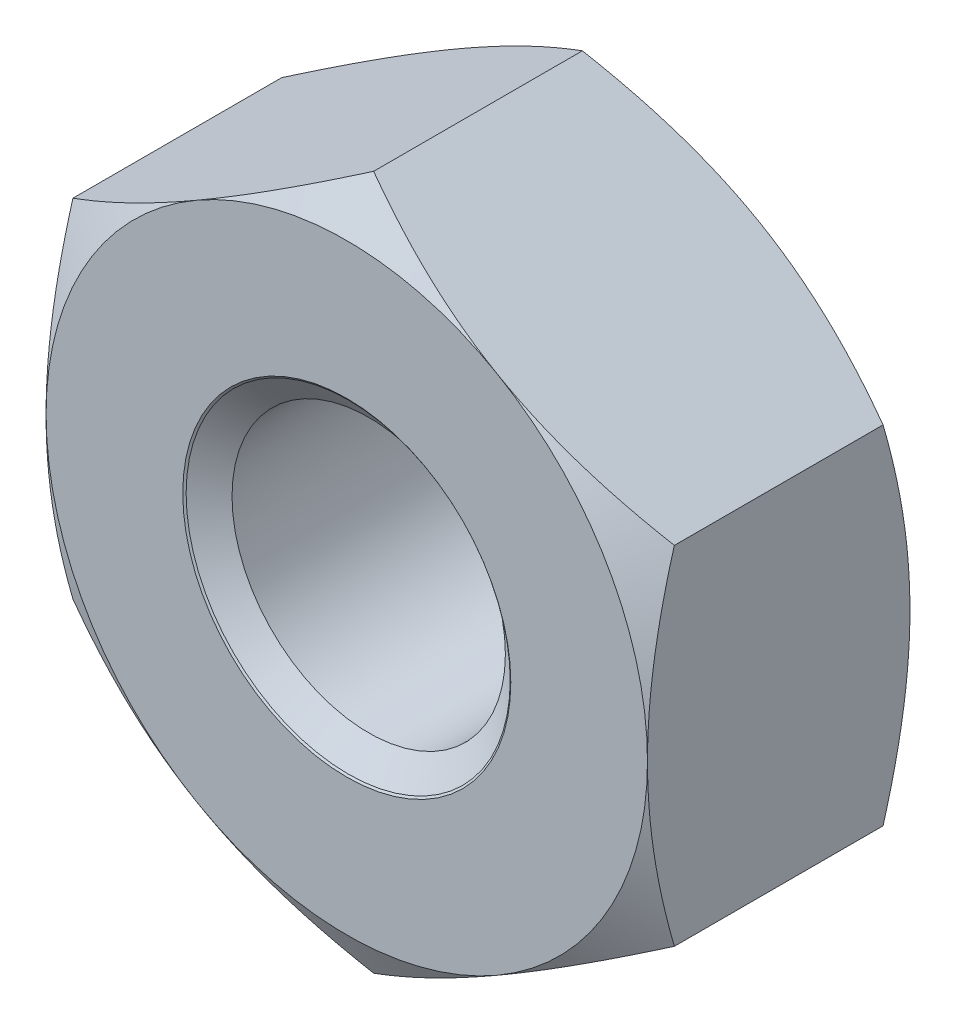
ISO-10303-21;
HEADER;
FILE_DESCRIPTION(('STEP AP214'),'2;1');
FILE_NAME('part.step','',(''),(''),'','','');
FILE_SCHEMA(('AUTOMOTIVE_DESIGN { 1 0 10303 214 1 1 1 1 }'));
ENDSEC;
DATA;
#1=APPLICATION_CONTEXT('core data for automotive mechanical design processes');
#2=APPLICATION_PROTOCOL_DEFINITION('international standard','automotive_design',2000,#1);
#3=PRODUCT_CONTEXT('',#1,'mechanical');
#4=PRODUCT('Part','Part','',(#3));
#5=PRODUCT_RELATED_PRODUCT_CATEGORY('part','',(#4));
#6=PRODUCT_DEFINITION_FORMATION('','',#4);
#7=PRODUCT_DEFINITION_CONTEXT('part definition',#1,'design');
#8=PRODUCT_DEFINITION('design','',#6,#7);
#9=PRODUCT_DEFINITION_SHAPE('','',#8);
#10=(LENGTH_UNIT() NAMED_UNIT(*) SI_UNIT(.MILLI.,.METRE.));
#11=(NAMED_UNIT(*) PLANE_ANGLE_UNIT() SI_UNIT($,.RADIAN.));
#12=(NAMED_UNIT(*) SI_UNIT($,.STERADIAN.) SOLID_ANGLE_UNIT());
#13=UNCERTAINTY_MEASURE_WITH_UNIT(LENGTH_MEASURE(1.E-05),#10,'distance_accuracy_value','');
#14=(GEOMETRIC_REPRESENTATION_CONTEXT(3) GLOBAL_UNCERTAINTY_ASSIGNED_CONTEXT((#13)) GLOBAL_UNIT_ASSIGNED_CONTEXT((#10,
#11,#12)) REPRESENTATION_CONTEXT('',''));
#15=CARTESIAN_POINT('',(0.,0.,0.));
#16=DIRECTION('',(0.,0.,1.));
#17=DIRECTION('',(1.,0.,0.));
#18=AXIS2_PLACEMENT_3D('',#15,#16,#17);
#19=CARTESIAN_POINT('',(0.,0.,-2.4));
#20=DIRECTION('',(0.,0.,1.));
#21=DIRECTION('',(1.,0.,0.));
#22=AXIS2_PLACEMENT_3D('',#19,#20,#21);
#23=CYLINDRICAL_SURFACE('',#22,1.25);
#24=CARTESIAN_POINT('',(0.,0.,-0.20045188455243));
#25=DIRECTION('',(0.,0.,-1.));
#26=DIRECTION('',(-1.,0.,0.));
#27=AXIS2_PLACEMENT_3D('',#24,#25,#26);
#28=CIRCLE('',#27,1.25);
#29=CARTESIAN_POINT('',(-1.25,0.,-0.20045188455243));
#30=VERTEX_POINT('',#29);
#31=EDGE_CURVE('E303',#30,#30,#28,.T.);
#32=ORIENTED_EDGE('',*,*,#31,.F.);
#33=EDGE_LOOP('',(#32));
#34=FACE_BOUND('',#33,.T.);
#35=CARTESIAN_POINT('',(0.,0.,-2.19954811544757));
#36=DIRECTION('',(0.,0.,-1.));
#37=DIRECTION('',(-1.,0.,0.));
#38=AXIS2_PLACEMENT_3D('',#35,#36,#37);
#39=CIRCLE('',#38,1.25);
#40=CARTESIAN_POINT('',(-1.25,0.,-2.19954811544757));
#41=VERTEX_POINT('',#40);
#42=EDGE_CURVE('E173',#41,#41,#39,.F.);
#43=ORIENTED_EDGE('',*,*,#42,.F.);
#44=EDGE_LOOP('',(#43));
#45=FACE_BOUND('',#44,.T.);
#46=ADVANCED_FACE('F30',(#34,#45),#23,.F.);
#47=CARTESIAN_POINT('',(-5.5,0.,-2.4));
#48=DIRECTION('',(0.,0.,1.));
#49=DIRECTION('',(1.,0.,0.));
#50=AXIS2_PLACEMENT_3D('',#47,#48,#49);
#51=PLANE('',#50);
#52=CARTESIAN_POINT('',(0.,0.,-2.4));
#53=DIRECTION('',(0.,0.,1.));
#54=DIRECTION('',(1.,0.,0.));
#55=AXIS2_PLACEMENT_3D('',#52,#53,#54);
#56=CIRCLE('',#55,2.75);
#57=CARTESIAN_POINT('',(2.75,0.,-2.4));
#58=VERTEX_POINT('',#57);
#59=CARTESIAN_POINT('',(1.375,2.38156986040721,-2.4));
#60=VERTEX_POINT('',#59);
#61=EDGE_CURVE('E240',#58,#60,#56,.T.);
#62=ORIENTED_EDGE('',*,*,#61,.F.);
#63=CARTESIAN_POINT('',(0.,0.,-2.4));
#64=DIRECTION('',(0.,0.,1.));
#65=DIRECTION('',(1.,0.,0.));
#66=AXIS2_PLACEMENT_3D('',#63,#64,#65);
#67=CIRCLE('',#66,2.75);
#68=CARTESIAN_POINT('',(1.375,-2.38156986040721,-2.4));
#69=VERTEX_POINT('',#68);
#70=EDGE_CURVE('E165',#58,#69,#67,.F.);
#71=ORIENTED_EDGE('',*,*,#70,.T.);
#72=CARTESIAN_POINT('',(-1.375,-2.38156986040721,-2.4));
#73=VERTEX_POINT('',#72);
#74=EDGE_CURVE('E167',#69,#73,#67,.F.);
#75=ORIENTED_EDGE('',*,*,#74,.T.);
#76=CARTESIAN_POINT('',(-2.75,0.,-2.4));
#77=VERTEX_POINT('',#76);
#78=EDGE_CURVE('E535',#73,#77,#67,.F.);
#79=ORIENTED_EDGE('',*,*,#78,.T.);
#80=CARTESIAN_POINT('',(-1.375,2.38156986040721,-2.4));
#81=VERTEX_POINT('',#80);
#82=EDGE_CURVE('E537',#77,#81,#67,.F.);
#83=ORIENTED_EDGE('',*,*,#82,.T.);
#84=EDGE_CURVE('E149',#81,#60,#67,.F.);
#85=ORIENTED_EDGE('',*,*,#84,.T.);
#86=EDGE_LOOP('',(#62,#71,#75,#79,#83,#85));
#87=FACE_BOUND('',#86,.T.);
#88=CARTESIAN_POINT('',(0.,0.,-2.4));
#89=DIRECTION('',(0.,0.,1.));
#90=DIRECTION('',(1.,0.,0.));
#91=AXIS2_PLACEMENT_3D('',#88,#89,#90);
#92=CIRCLE('',#91,1.5);
#93=CARTESIAN_POINT('',(1.5,0.,-2.4));
#94=VERTEX_POINT('',#93);
#95=EDGE_CURVE('E171',#94,#94,#92,.F.);
#96=ORIENTED_EDGE('',*,*,#95,.F.);
#97=EDGE_LOOP('',(#96));
#98=FACE_BOUND('',#97,.T.);
#99=ADVANCED_FACE('F292',(#87,#98),#51,.F.);
#100=CARTESIAN_POINT('',(-5.5,0.,0.));
#101=DIRECTION('',(0.,0.,1.));
#102=DIRECTION('',(1.,0.,0.));
#103=AXIS2_PLACEMENT_3D('',#100,#101,#102);
#104=PLANE('',#103);
#105=CARTESIAN_POINT('',(0.,0.,0.));
#106=DIRECTION('',(0.,0.,1.));
#107=DIRECTION('',(1.,0.,0.));
#108=AXIS2_PLACEMENT_3D('',#105,#106,#107);
#109=CIRCLE('',#108,2.75);
#110=CARTESIAN_POINT('',(1.375,-2.38156986040721,0.));
#111=VERTEX_POINT('',#110);
#112=CARTESIAN_POINT('',(2.75,0.,0.));
#113=VERTEX_POINT('',#112);
#114=EDGE_CURVE('E42',#111,#113,#109,.T.);
#115=ORIENTED_EDGE('',*,*,#114,.T.);
#116=CARTESIAN_POINT('',(0.,0.,0.));
#117=DIRECTION('',(0.,0.,1.));
#118=DIRECTION('',(1.,0.,0.));
#119=AXIS2_PLACEMENT_3D('',#116,#117,#118);
#120=CIRCLE('',#119,2.75);
#121=CARTESIAN_POINT('',(1.375,2.38156986040721,0.));
#122=VERTEX_POINT('',#121);
#123=EDGE_CURVE('E49',#113,#122,#120,.T.);
#124=ORIENTED_EDGE('',*,*,#123,.T.);
#125=CARTESIAN_POINT('',(-1.375,2.38156986040721,0.));
#126=VERTEX_POINT('',#125);
#127=EDGE_CURVE('E11',#122,#126,#109,.T.);
#128=ORIENTED_EDGE('',*,*,#127,.T.);
#129=CARTESIAN_POINT('',(-2.75,0.,0.));
#130=VERTEX_POINT('',#129);
#131=EDGE_CURVE('E40',#126,#130,#109,.T.);
#132=ORIENTED_EDGE('',*,*,#131,.T.);
#133=CARTESIAN_POINT('',(-1.375,-2.38156986040721,0.));
#134=VERTEX_POINT('',#133);
#135=EDGE_CURVE('E512',#130,#134,#109,.T.);
#136=ORIENTED_EDGE('',*,*,#135,.T.);
#137=EDGE_CURVE('E170',#134,#111,#109,.T.);
#138=ORIENTED_EDGE('',*,*,#137,.T.);
#139=EDGE_LOOP('',(#115,#124,#128,#132,#136,#138));
#140=FACE_BOUND('',#139,.T.);
#141=CARTESIAN_POINT('',(0.,0.,0.));
#142=DIRECTION('',(0.,0.,1.));
#143=DIRECTION('',(1.,0.,0.));
#144=AXIS2_PLACEMENT_3D('',#141,#142,#143);
#145=CIRCLE('',#144,1.5);
#146=CARTESIAN_POINT('',(1.5,0.,0.));
#147=VERTEX_POINT('',#146);
#148=EDGE_CURVE('E176',#147,#147,#145,.T.);
#149=ORIENTED_EDGE('',*,*,#148,.F.);
#150=EDGE_LOOP('',(#149));
#151=FACE_BOUND('',#150,.T.);
#152=ADVANCED_FACE('F245',(#140,#151),#104,.T.);
#153=CARTESIAN_POINT('',(0.,3.17542648054294,-2.4));
#154=DIRECTION('',(-0.5,0.866025403784438,0.));
#155=DIRECTION('',(-0.866025403784438,-0.500000000000001,0.));
#156=AXIS2_PLACEMENT_3D('',#153,#154,#155);
#157=PLANE('',#156);
#158=DIRECTION('',(0.,0.,1.));
#159=VECTOR('',#158,1.);
#160=CARTESIAN_POINT('',(-2.75,1.58771324027147,-2.4));
#161=LINE('',#160,#159);
#162=CARTESIAN_POINT('',(-2.75,1.58771324027147,-2.15437990693814));
#163=VERTEX_POINT('',#162);
#164=CARTESIAN_POINT('',(-2.75,1.58771324027147,-0.245620093061863));
#165=VERTEX_POINT('',#164);
#166=EDGE_CURVE('E161',#163,#165,#161,.T.);
#167=ORIENTED_EDGE('',*,*,#166,.T.);
#168=CARTESIAN_POINT('',(-2.7502,1.58759777021763,-0.245686763364761));
#169=CARTESIAN_POINT('',(-2.62935077934009,1.65737010029699,-0.205387662249264));
#170=CARTESIAN_POINT('',(-2.50745839737737,1.72774469983533,-0.168736902597662));
#171=CARTESIAN_POINT('',(-2.26156287327211,1.86971254687003,-0.104762182969801));
#172=CARTESIAN_POINT('',(-2.13755536142614,1.94130831721583,-0.0774608556744972));
#173=CARTESIAN_POINT('',(-1.89107720202406,2.08361254889599,-0.0349617452941165));
#174=CARTESIAN_POINT('',(-1.76864448141258,2.15429911309864,-0.0194811186224574));
#175=CARTESIAN_POINT('',(-1.52320285763108,2.29600490065923,-0.00099939736994006));
#176=CARTESIAN_POINT('',(-1.40019484676709,2.36702360884404,0.00201700053740068));
#177=CARTESIAN_POINT('',(-1.17034121338921,2.49972966594897,-0.00425314542854645));
#178=CARTESIAN_POINT('',(-1.06346120874598,2.56143686540073,-0.0120001542767022));
#179=CARTESIAN_POINT('',(-0.85039753266525,2.68444923614047,-0.0365551810643549));
#180=CARTESIAN_POINT('',(-0.74421459835111,2.74575398185008,-0.0533715896505705));
#181=CARTESIAN_POINT('',(-0.530711510606816,2.86902004703206,-0.0954119223459568));
#182=CARTESIAN_POINT('',(-0.423418383857145,2.93096576264318,-0.120814080687231));
#183=CARTESIAN_POINT('',(-0.210432520715949,3.05393320806134,-0.178467225839983));
#184=CARTESIAN_POINT('',(-0.104737054973347,3.11495651365995,-0.210704663298984));
#185=CARTESIAN_POINT('',(0.000200000000000215,3.17554195059678,-0.245686763364762));
#186=B_SPLINE_CURVE_WITH_KNOTS('',3,(#168,#169,#170,#171,#172,#173,#174,#175,#176,#177,#178,
#179,#180,#181,#182,#183,#184,#185),.UNSPECIFIED.,.F.,.F.,(4,2,2,2,2,2,2,2,4),(0.,
0.435912828725889,0.872873557116333,1.29901931904672,1.72464171213574,2.09526089052938,
2.46622354066374,2.84541551798557,3.22386274754525),.UNSPECIFIED.);
#187=EDGE_CURVE('E57',#165,#126,#186,.T.);
#188=ORIENTED_EDGE('',*,*,#187,.T.);
#189=CARTESIAN_POINT('',(0.,3.17542648054294,-0.245620093061864));
#190=VERTEX_POINT('',#189);
#191=EDGE_CURVE('E234',#126,#190,#186,.T.);
#192=ORIENTED_EDGE('',*,*,#191,.T.);
#193=DIRECTION('',(0.,0.,1.));
#194=VECTOR('',#193,1.);
#195=CARTESIAN_POINT('',(0.,3.17542648054294,-2.4));
#196=LINE('',#195,#194);
#197=CARTESIAN_POINT('',(0.,3.17542648054294,-2.15437990693814));
#198=VERTEX_POINT('',#197);
#199=EDGE_CURVE('E146',#198,#190,#196,.T.);
#200=ORIENTED_EDGE('',*,*,#199,.F.);
#201=CARTESIAN_POINT('',(-2.7502,1.58759777021763,-2.15431323663524));
#202=CARTESIAN_POINT('',(-2.62935077934009,1.65737010029698,-2.19461233775074));
#203=CARTESIAN_POINT('',(-2.50745839737737,1.72774469983533,-2.23126309740234));
#204=CARTESIAN_POINT('',(-2.26156287327211,1.86971254687003,-2.2952378170302));
#205=CARTESIAN_POINT('',(-2.13755536142614,1.94130831721583,-2.3225391443255));
#206=CARTESIAN_POINT('',(-1.89107720202406,2.08361254889599,-2.36503825470588));
#207=CARTESIAN_POINT('',(-1.76864448141258,2.15429911309864,-2.38051888137754));
#208=CARTESIAN_POINT('',(-1.52320285763108,2.29600490065923,-2.39900060263006));
#209=CARTESIAN_POINT('',(-1.40019484676709,2.36702360884404,-2.4020170005374));
#210=CARTESIAN_POINT('',(-1.17034121338921,2.49972966594897,-2.39574685457145));
#211=CARTESIAN_POINT('',(-1.06346120874598,2.56143686540073,-2.3879998457233));
#212=CARTESIAN_POINT('',(-0.85039753266525,2.68444923614047,-2.36344481893564));
#213=CARTESIAN_POINT('',(-0.74421459835111,2.74575398185008,-2.34662841034943));
#214=CARTESIAN_POINT('',(-0.530711510606816,2.86902004703206,-2.30458807765404));
#215=CARTESIAN_POINT('',(-0.423418383857145,2.93096576264318,-2.27918591931277));
#216=CARTESIAN_POINT('',(-0.210432520715948,3.05393320806134,-2.22153277416002));
#217=CARTESIAN_POINT('',(-0.104737054973347,3.11495651365995,-2.18929533670102));
#218=CARTESIAN_POINT('',(0.000200000000000215,3.17554195059678,-2.15431323663524));
#219=B_SPLINE_CURVE_WITH_KNOTS('',3,(#201,#202,#203,#204,#205,#206,#207,#208,#209,#210,#211,
#212,#213,#214,#215,#216,#217,#218),.UNSPECIFIED.,.F.,.F.,(4,2,2,2,2,2,2,2,4),(0.,
0.435912828725888,0.872873557116333,1.29901931904672,1.72464171213574,2.09526089052938,
2.46622354066374,2.84541551798557,3.22386274754524),.UNSPECIFIED.);
#220=EDGE_CURVE('E164',#81,#198,#219,.T.);
#221=ORIENTED_EDGE('',*,*,#220,.F.);
#222=EDGE_CURVE('E255',#163,#81,#219,.T.);
#223=ORIENTED_EDGE('',*,*,#222,.F.);
#224=EDGE_LOOP('',(#167,#188,#192,#200,#221,#223));
#225=FACE_BOUND('',#224,.T.);
#226=ADVANCED_FACE('F32',(#225),#157,.T.);
#227=CARTESIAN_POINT('',(2.75,1.58771324027147,-2.4));
#228=DIRECTION('',(0.5,0.866025403784438,0.));
#229=DIRECTION('',(-0.866025403784438,0.5,0.));
#230=AXIS2_PLACEMENT_3D('',#227,#228,#229);
#231=PLANE('',#230);
#232=ORIENTED_EDGE('',*,*,#199,.T.);
#233=CARTESIAN_POINT('',(-0.000200000000000213,3.17554195059678,-0.245686763364762));
#234=CARTESIAN_POINT('',(0.120649220659906,3.10576962051743,-0.205387662249264));
#235=CARTESIAN_POINT('',(0.242541602622634,3.03539502097908,-0.168736902597663));
#236=CARTESIAN_POINT('',(0.488437126727893,2.89342717394439,-0.104762182969801));
#237=CARTESIAN_POINT('',(0.612444638573856,2.82183140359858,-0.0774608556744976));
#238=CARTESIAN_POINT('',(0.858922797975945,2.67952717191842,-0.0349617452941167));
#239=CARTESIAN_POINT('',(0.981355518587418,2.60884060771577,-0.0194811186224575));
#240=CARTESIAN_POINT('',(1.22679714236892,2.46713482015518,-0.000999397369940103));
#241=CARTESIAN_POINT('',(1.34980515323291,2.39611611197037,0.0020170005374006));
#242=CARTESIAN_POINT('',(1.57965878661079,2.26341005486544,-0.00425314542854638));
#243=CARTESIAN_POINT('',(1.68653879125402,2.20170285541368,-0.012000154276702));
#244=CARTESIAN_POINT('',(1.89960246733475,2.07869048467395,-0.0365551810643544));
#245=CARTESIAN_POINT('',(2.00578540164889,2.01738573896433,-0.05337158965057));
#246=CARTESIAN_POINT('',(2.21928848939318,1.89411967378235,-0.0954119223459563));
#247=CARTESIAN_POINT('',(2.32658161614285,1.83217395817123,-0.120814080687231));
#248=CARTESIAN_POINT('',(2.53956747928405,1.70920651275307,-0.178467225839982));
#249=CARTESIAN_POINT('',(2.64526294502665,1.64818320715446,-0.210704663298983));
#250=CARTESIAN_POINT('',(2.7502,1.58759777021763,-0.245686763364761));
#251=B_SPLINE_CURVE_WITH_KNOTS('',3,(#233,#234,#235,#236,#237,#238,#239,#240,#241,#242,#243,
#244,#245,#246,#247,#248,#249,#250),.UNSPECIFIED.,.F.,.F.,(4,2,2,2,2,2,2,2,4),(0.,
0.435912828725889,0.872873557116334,1.29901931904672,1.72464171213574,2.09526089052938,
2.46622354066374,2.84541551798557,3.22386274754524),.UNSPECIFIED.);
#252=EDGE_CURVE('E139',#190,#122,#251,.T.);
#253=ORIENTED_EDGE('',*,*,#252,.T.);
#254=CARTESIAN_POINT('',(2.75,1.58771324027147,-0.245620093061864));
#255=VERTEX_POINT('',#254);
#256=EDGE_CURVE('E125',#122,#255,#251,.T.);
#257=ORIENTED_EDGE('',*,*,#256,.T.);
#258=DIRECTION('',(0.,0.,1.));
#259=VECTOR('',#258,1.);
#260=CARTESIAN_POINT('',(2.75,1.58771324027147,-2.4));
#261=LINE('',#260,#259);
#262=CARTESIAN_POINT('',(2.75,1.58771324027147,-2.15437990693814));
#263=VERTEX_POINT('',#262);
#264=EDGE_CURVE('E138',#263,#255,#261,.T.);
#265=ORIENTED_EDGE('',*,*,#264,.F.);
#266=CARTESIAN_POINT('',(-0.000200000000000213,3.17554195059678,-2.15431323663524));
#267=CARTESIAN_POINT('',(0.120649220659906,3.10576962051743,-2.19461233775073));
#268=CARTESIAN_POINT('',(0.242541602622634,3.03539502097908,-2.23126309740234));
#269=CARTESIAN_POINT('',(0.488437126727893,2.89342717394439,-2.2952378170302));
#270=CARTESIAN_POINT('',(0.612444638573856,2.82183140359858,-2.3225391443255));
#271=CARTESIAN_POINT('',(0.858922797975945,2.67952717191842,-2.36503825470588));
#272=CARTESIAN_POINT('',(0.981355518587418,2.60884060771577,-2.38051888137754));
#273=CARTESIAN_POINT('',(1.22679714236892,2.46713482015518,-2.39900060263006));
#274=CARTESIAN_POINT('',(1.34980515323291,2.39611611197037,-2.4020170005374));
#275=CARTESIAN_POINT('',(1.57965878661079,2.26341005486544,-2.39574685457145));
#276=CARTESIAN_POINT('',(1.68653879125402,2.20170285541368,-2.3879998457233));
#277=CARTESIAN_POINT('',(1.89960246733475,2.07869048467395,-2.36344481893565));
#278=CARTESIAN_POINT('',(2.00578540164889,2.01738573896433,-2.34662841034943));
#279=CARTESIAN_POINT('',(2.21928848939318,1.89411967378235,-2.30458807765404));
#280=CARTESIAN_POINT('',(2.32658161614285,1.83217395817123,-2.27918591931277));
#281=CARTESIAN_POINT('',(2.53956747928405,1.70920651275307,-2.22153277416002));
#282=CARTESIAN_POINT('',(2.64526294502665,1.64818320715446,-2.18929533670102));
#283=CARTESIAN_POINT('',(2.7502,1.58759777021763,-2.15431323663524));
#284=B_SPLINE_CURVE_WITH_KNOTS('',3,(#266,#267,#268,#269,#270,#271,#272,#273,#274,#275,#276,
#277,#278,#279,#280,#281,#282,#283),.UNSPECIFIED.,.F.,.F.,(4,2,2,2,2,2,2,2,4),(0.,
0.435912828725889,0.872873557116334,1.29901931904672,1.72464171213574,2.09526089052938,
2.46622354066374,2.84541551798557,3.22386274754524),.UNSPECIFIED.);
#285=EDGE_CURVE('E249',#60,#263,#284,.T.);
#286=ORIENTED_EDGE('',*,*,#285,.F.);
#287=EDGE_CURVE('E254',#198,#60,#284,.T.);
#288=ORIENTED_EDGE('',*,*,#287,.F.);
#289=EDGE_LOOP('',(#232,#253,#257,#265,#286,#288));
#290=FACE_BOUND('',#289,.T.);
#291=ADVANCED_FACE('F136',(#290),#231,.T.);
#292=CARTESIAN_POINT('',(2.75,1.58771324027147,-2.4));
#293=DIRECTION('',(-1.,0.,0.));
#294=DIRECTION('',(0.,0.,1.));
#295=AXIS2_PLACEMENT_3D('',#292,#293,#294);
#296=PLANE('',#295);
#297=CARTESIAN_POINT('',(2.75,-4.21084949309676,-1.31594843960294));
#298=CARTESIAN_POINT('',(2.75,-4.0901089421409,-1.25759993615224));
#299=CARTESIAN_POINT('',(2.75,-3.96908292065509,-1.19983146511759));
#300=CARTESIAN_POINT('',(2.75,-3.72630558284844,-1.08578603842305));
#301=CARTESIAN_POINT('',(2.75,-3.604554145362,-1.02950934100247));
#302=CARTESIAN_POINT('',(2.75,-3.35951393034354,-0.91848244335276));
#303=CARTESIAN_POINT('',(2.75,-3.23622034236436,-0.86374282160584));
#304=CARTESIAN_POINT('',(2.75,-2.98861980138743,-0.756614777476456));
#305=CARTESIAN_POINT('',(2.75,-2.86431290161182,-0.704226232536765));
#306=CARTESIAN_POINT('',(2.75,-2.61294485887172,-0.601803572146125));
#307=CARTESIAN_POINT('',(2.75,-2.48586863815654,-0.551806257898394));
#308=CARTESIAN_POINT('',(2.75,-2.23021732171541,-0.455727408784601));
#309=CARTESIAN_POINT('',(2.75,-2.10164206103363,-0.409646309576972));
#310=CARTESIAN_POINT('',(2.75,-1.84305218799467,-0.322638077046232));
#311=CARTESIAN_POINT('',(2.75,-1.71304130052583,-0.281699986413888));
#312=CARTESIAN_POINT('',(2.75,-1.45117125062148,-0.206307307624348));
#313=CARTESIAN_POINT('',(2.75,-1.31931268690202,-0.171850669152767));
#314=CARTESIAN_POINT('',(2.75,-1.05365722480012,-0.111093671530904));
#315=CARTESIAN_POINT('',(2.75,-0.919859820217591,-0.0847954840951215));
#316=CARTESIAN_POINT('',(2.75,-0.650651874037381,-0.0421260371966112));
#317=CARTESIAN_POINT('',(2.75,-0.515241331013594,-0.0257547865105431));
#318=CARTESIAN_POINT('',(2.75,-0.244373242869211,-0.00438749654023745));
#319=CARTESIAN_POINT('',(2.75,-0.108921526377132,0.000680556773216004));
#320=CARTESIAN_POINT('',(2.75,0.161887058855135,-0.000827795632672054));
#321=CARTESIAN_POINT('',(2.75,0.297243943089641,-0.00740117868555392));
#322=CARTESIAN_POINT('',(2.75,0.528385436717543,-0.0281041300468441));
#323=CARTESIAN_POINT('',(2.75,0.624425050137502,-0.0395376410301885));
#324=CARTESIAN_POINT('',(2.75,0.815762399811544,-0.0675217196133512));
#325=CARTESIAN_POINT('',(2.75,0.911060016631966,-0.0840730942276825));
#326=CARTESIAN_POINT('',(2.75,1.19576218748916,-0.140535361278285));
#327=CARTESIAN_POINT('',(2.75,1.38383224738497,-0.187239859417294));
#328=CARTESIAN_POINT('',(2.75,1.66525048947485,-0.267792497030579));
#329=CARTESIAN_POINT('',(2.75,1.76006556248558,-0.296803334995501));
#330=CARTESIAN_POINT('',(2.75,1.94870609382215,-0.357695648906588));
#331=CARTESIAN_POINT('',(2.75,2.04253218553696,-0.389575144878503));
#332=CARTESIAN_POINT('',(2.75,2.22880240354984,-0.455541418186448));
#333=CARTESIAN_POINT('',(2.75,2.32125133588451,-0.489614761455533));
#334=CARTESIAN_POINT('',(2.75,2.50543192042628,-0.559761368231109));
#335=CARTESIAN_POINT('',(2.75,2.59716326539579,-0.595835440037318));
#336=CARTESIAN_POINT('',(2.75,2.68856293053345,-0.632712441997484));
#337=B_SPLINE_CURVE_WITH_KNOTS('',3,(#297,#298,#299,#300,#301,#302,#303,#304,#305,#306,#307,
#308,#309,#310,#311,#312,#313,#314,#315,#316,#317,#318,#319,#320,#321,#322,#323,#324,#325,#326,
#327,#328,#329,#330,#331,#332,#333,#334,#335,#336),.UNSPECIFIED.,.F.,.F.,(4,2,2,2,2,2,2,2,2,2,2,
2,2,2,2,2,2,2,2,4),(0.,0.402305607365936,0.804680408536997,1.20935783819118,1.61401414820818,
2.0236383818577,2.43330812457349,2.842089694796,3.25074173456636,3.65950246109143,
4.06826354901184,4.4744128402465,4.88045669141172,5.17046846817546,5.46052599902452,
6.04107275309883,6.33851131304661,6.63574613017455,6.93130791005792,7.22698998004822),.UNSPECIFIED.);
#338=CARTESIAN_POINT('',(2.75,-1.58771324027147,-0.245620093061864));
#339=VERTEX_POINT('',#338);
#340=EDGE_CURVE('E131',#339,#113,#337,.T.);
#341=ORIENTED_EDGE('',*,*,#340,.F.);
#342=DIRECTION('',(0.,0.,1.));
#343=VECTOR('',#342,1.);
#344=CARTESIAN_POINT('',(2.75,-1.58771324027147,-2.4));
#345=LINE('',#344,#343);
#346=CARTESIAN_POINT('',(2.75,-1.58771324027147,-2.15437990693814));
#347=VERTEX_POINT('',#346);
#348=EDGE_CURVE('E147',#347,#339,#345,.T.);
#349=ORIENTED_EDGE('',*,*,#348,.F.);
#350=CARTESIAN_POINT('',(2.75,-4.21084949309676,-1.08405156039706));
#351=CARTESIAN_POINT('',(2.75,-4.0901089421409,-1.14240006384775));
#352=CARTESIAN_POINT('',(2.75,-3.96908292065509,-1.20016853488241));
#353=CARTESIAN_POINT('',(2.75,-3.72630558284844,-1.31421396157695));
#354=CARTESIAN_POINT('',(2.75,-3.604554145362,-1.37049065899753));
#355=CARTESIAN_POINT('',(2.75,-3.35951393034355,-1.48151755664724));
#356=CARTESIAN_POINT('',(2.75,-3.23622034236436,-1.53625717839416));
#357=CARTESIAN_POINT('',(2.75,-2.98861980138743,-1.64338522252354));
#358=CARTESIAN_POINT('',(2.75,-2.86431290161182,-1.69577376746323));
#359=CARTESIAN_POINT('',(2.75,-2.61294485887172,-1.79819642785387));
#360=CARTESIAN_POINT('',(2.75,-2.48586863815654,-1.84819374210161));
#361=CARTESIAN_POINT('',(2.75,-2.23021732171541,-1.9442725912154));
#362=CARTESIAN_POINT('',(2.75,-2.10164206103363,-1.99035369042303));
#363=CARTESIAN_POINT('',(2.75,-1.84305218799467,-2.07736192295377));
#364=CARTESIAN_POINT('',(2.75,-1.71304130052583,-2.11830001358611));
#365=CARTESIAN_POINT('',(2.75,-1.45117125062148,-2.19369269237565));
#366=CARTESIAN_POINT('',(2.75,-1.31931268690202,-2.22814933084723));
#367=CARTESIAN_POINT('',(2.75,-1.05365722480012,-2.2889063284691));
#368=CARTESIAN_POINT('',(2.75,-0.919859820217591,-2.31520451590488));
#369=CARTESIAN_POINT('',(2.75,-0.65065187403738,-2.35787396280339));
#370=CARTESIAN_POINT('',(2.75,-0.515241331013594,-2.37424521348946));
#371=CARTESIAN_POINT('',(2.75,-0.24437324286921,-2.39561250345976));
#372=CARTESIAN_POINT('',(2.75,-0.108921526377132,-2.40068055677322));
#373=CARTESIAN_POINT('',(2.75,0.161887058855135,-2.39917220436733));
#374=CARTESIAN_POINT('',(2.75,0.297243943089641,-2.39259882131445));
#375=CARTESIAN_POINT('',(2.75,0.528385436717543,-2.37189586995316));
#376=CARTESIAN_POINT('',(2.75,0.624425050137501,-2.36046235896981));
#377=CARTESIAN_POINT('',(2.75,0.815762399811543,-2.33247828038665));
#378=CARTESIAN_POINT('',(2.75,0.911060016631965,-2.31592690577232));
#379=CARTESIAN_POINT('',(2.75,1.19576218748916,-2.25946463872172));
#380=CARTESIAN_POINT('',(2.75,1.38383224738496,-2.21276014058271));
#381=CARTESIAN_POINT('',(2.75,1.66525048947485,-2.13220750296942));
#382=CARTESIAN_POINT('',(2.75,1.76006556248557,-2.1031966650045));
#383=CARTESIAN_POINT('',(2.75,1.94870609382215,-2.04230435109341));
#384=CARTESIAN_POINT('',(2.75,2.04253218553695,-2.0104248551215));
#385=CARTESIAN_POINT('',(2.75,2.22880240354984,-1.94445858181355));
#386=CARTESIAN_POINT('',(2.75,2.32125133588451,-1.91038523854447));
#387=CARTESIAN_POINT('',(2.75,2.50543192042628,-1.84023863176889));
#388=CARTESIAN_POINT('',(2.75,2.59716326539578,-1.80416455996268));
#389=CARTESIAN_POINT('',(2.75,2.68856293053345,-1.76728755800252));
#390=B_SPLINE_CURVE_WITH_KNOTS('',3,(#350,#351,#352,#353,#354,#355,#356,#357,#358,#359,#360,
#361,#362,#363,#364,#365,#366,#367,#368,#369,#370,#371,#372,#373,#374,#375,#376,#377,#378,#379,
#380,#381,#382,#383,#384,#385,#386,#387,#388,#389),.UNSPECIFIED.,.F.,.F.,(4,2,2,2,2,2,2,2,2,2,2,
2,2,2,2,2,2,2,2,4),(0.,0.402305607365936,0.804680408536996,1.20935783819118,1.61401414820818,
2.0236383818577,2.43330812457349,2.842089694796,3.25074173456636,3.65950246109143,
4.06826354901184,4.4744128402465,4.88045669141172,5.17046846817546,5.46052599902452,
6.04107275309882,6.33851131304661,6.63574613017454,6.93130791005792,7.22698998004822),.UNSPECIFIED.);
#391=EDGE_CURVE('E260',#347,#58,#390,.T.);
#392=ORIENTED_EDGE('',*,*,#391,.T.);
#393=EDGE_CURVE('E145',#58,#263,#390,.T.);
#394=ORIENTED_EDGE('',*,*,#393,.T.);
#395=ORIENTED_EDGE('',*,*,#264,.T.);
#396=EDGE_CURVE('E122',#113,#255,#337,.T.);
#397=ORIENTED_EDGE('',*,*,#396,.F.);
#398=EDGE_LOOP('',(#341,#349,#392,#394,#395,#397));
#399=FACE_BOUND('',#398,.T.);
#400=ADVANCED_FACE('F142',(#399),#296,.F.);
#401=CARTESIAN_POINT('',(0.,-3.17542648054295,-2.4));
#402=DIRECTION('',(0.5,-0.866025403784438,0.));
#403=DIRECTION('',(0.866025403784438,0.500000000000001,0.));
#404=AXIS2_PLACEMENT_3D('',#401,#402,#403);
#405=PLANE('',#404);
#406=ORIENTED_EDGE('',*,*,#348,.T.);
#407=CARTESIAN_POINT('',(2.7502,-1.58759777021763,-0.245686763364762));
#408=CARTESIAN_POINT('',(2.62935077934009,-1.65737010029699,-0.205387662249265));
#409=CARTESIAN_POINT('',(2.50745839737737,-1.72774469983533,-0.168736902597664));
#410=CARTESIAN_POINT('',(2.26156287327211,-1.86971254687003,-0.104762182969802));
#411=CARTESIAN_POINT('',(2.13755536142614,-1.94130831721583,-0.0774608556744987));
#412=CARTESIAN_POINT('',(1.89107720202406,-2.08361254889599,-0.0349617452941179));
#413=CARTESIAN_POINT('',(1.76864448141258,-2.15429911309864,-0.0194811186224588));
#414=CARTESIAN_POINT('',(1.52320285763108,-2.29600490065923,-0.000999397369941502));
#415=CARTESIAN_POINT('',(1.40019484676709,-2.36702360884404,0.0020170005373991));
#416=CARTESIAN_POINT('',(1.17034121338921,-2.49972966594897,-0.00425314542854835));
#417=CARTESIAN_POINT('',(1.06346120874598,-2.56143686540073,-0.0120001542767043));
#418=CARTESIAN_POINT('',(0.850397532665249,-2.68444923614047,-0.0365551810643571));
#419=CARTESIAN_POINT('',(0.744214598351109,-2.74575398185008,-0.0533715896505728));
#420=CARTESIAN_POINT('',(0.530711510606815,-2.86902004703207,-0.0954119223459591));
#421=CARTESIAN_POINT('',(0.423418383857144,-2.93096576264319,-0.120814080687234));
#422=CARTESIAN_POINT('',(0.210432520715948,-3.05393320806134,-0.178467225839985));
#423=CARTESIAN_POINT('',(0.104737054973347,-3.11495651365996,-0.210704663298986));
#424=CARTESIAN_POINT('',(-0.000200000000000485,-3.17554195059678,-0.245686763364764));
#425=B_SPLINE_CURVE_WITH_KNOTS('',3,(#407,#408,#409,#410,#411,#412,#413,#414,#415,#416,#417,
#418,#419,#420,#421,#422,#423,#424),.UNSPECIFIED.,.F.,.F.,(4,2,2,2,2,2,2,2,4),(0.,
0.435912828725888,0.872873557116333,1.29901931904672,1.72464171213574,2.09526089052938,
2.46622354066375,2.84541551798557,3.22386274754525),.UNSPECIFIED.);
#426=EDGE_CURVE('E542',#339,#111,#425,.T.);
#427=ORIENTED_EDGE('',*,*,#426,.T.);
#428=CARTESIAN_POINT('',(0.,-3.17542648054294,-0.245620093061864));
#429=VERTEX_POINT('',#428);
#430=EDGE_CURVE('E221',#111,#429,#425,.T.);
#431=ORIENTED_EDGE('',*,*,#430,.T.);
#432=DIRECTION('',(0.,0.,1.));
#433=VECTOR('',#432,1.);
#434=CARTESIAN_POINT('',(0.,-3.17542648054295,-2.4));
#435=LINE('',#434,#433);
#436=CARTESIAN_POINT('',(0.,-3.17542648054294,-2.15437990693814));
#437=VERTEX_POINT('',#436);
#438=EDGE_CURVE('E152',#437,#429,#435,.T.);
#439=ORIENTED_EDGE('',*,*,#438,.F.);
#440=CARTESIAN_POINT('',(2.7502,-1.58759777021763,-2.15431323663524));
#441=CARTESIAN_POINT('',(2.62935077934009,-1.65737010029699,-2.19461233775073));
#442=CARTESIAN_POINT('',(2.50745839737737,-1.72774469983533,-2.23126309740234));
#443=CARTESIAN_POINT('',(2.26156287327211,-1.86971254687003,-2.2952378170302));
#444=CARTESIAN_POINT('',(2.13755536142614,-1.94130831721583,-2.3225391443255));
#445=CARTESIAN_POINT('',(1.89107720202406,-2.08361254889599,-2.36503825470588));
#446=CARTESIAN_POINT('',(1.76864448141258,-2.15429911309864,-2.38051888137754));
#447=CARTESIAN_POINT('',(1.52320285763108,-2.29600490065923,-2.39900060263006));
#448=CARTESIAN_POINT('',(1.40019484676709,-2.36702360884404,-2.4020170005374));
#449=CARTESIAN_POINT('',(1.17034121338921,-2.49972966594897,-2.39574685457145));
#450=CARTESIAN_POINT('',(1.06346120874598,-2.56143686540073,-2.3879998457233));
#451=CARTESIAN_POINT('',(0.850397532665249,-2.68444923614047,-2.36344481893564));
#452=CARTESIAN_POINT('',(0.74421459835111,-2.74575398185008,-2.34662841034943));
#453=CARTESIAN_POINT('',(0.530711510606815,-2.86902004703207,-2.30458807765404));
#454=CARTESIAN_POINT('',(0.423418383857144,-2.93096576264319,-2.27918591931277));
#455=CARTESIAN_POINT('',(0.210432520715948,-3.05393320806134,-2.22153277416001));
#456=CARTESIAN_POINT('',(0.104737054973346,-3.11495651365996,-2.18929533670101));
#457=CARTESIAN_POINT('',(-0.000200000000000482,-3.17554195059678,-2.15431323663524));
#458=B_SPLINE_CURVE_WITH_KNOTS('',3,(#440,#441,#442,#443,#444,#445,#446,#447,#448,#449,#450,
#451,#452,#453,#454,#455,#456,#457),.UNSPECIFIED.,.F.,.F.,(4,2,2,2,2,2,2,2,4),(0.,
0.435912828725888,0.872873557116333,1.29901931904672,1.72464171213574,2.09526089052938,
2.46622354066375,2.84541551798557,3.22386274754524),.UNSPECIFIED.);
#459=EDGE_CURVE('E266',#69,#437,#458,.T.);
#460=ORIENTED_EDGE('',*,*,#459,.F.);
#461=EDGE_CURVE('E265',#347,#69,#458,.T.);
#462=ORIENTED_EDGE('',*,*,#461,.F.);
#463=EDGE_LOOP('',(#406,#427,#431,#439,#460,#462));
#464=FACE_BOUND('',#463,.T.);
#465=ADVANCED_FACE('F276',(#464),#405,.T.);
#466=CARTESIAN_POINT('',(-2.75,-1.58771324027147,-2.4));
#467=DIRECTION('',(-0.5,-0.866025403784438,0.));
#468=DIRECTION('',(0.866025403784438,-0.500000000000001,0.));
#469=AXIS2_PLACEMENT_3D('',#466,#467,#468);
#470=PLANE('',#469);
#471=ORIENTED_EDGE('',*,*,#438,.T.);
#472=CARTESIAN_POINT('',(0.000199999999999971,-3.17554195059678,-0.245686763364764));
#473=CARTESIAN_POINT('',(-0.120649220659906,-3.10576962051743,-0.205387662249267));
#474=CARTESIAN_POINT('',(-0.242541602622634,-3.03539502097908,-0.168736902597665));
#475=CARTESIAN_POINT('',(-0.488437126727893,-2.89342717394439,-0.104762182969803));
#476=CARTESIAN_POINT('',(-0.612444638573856,-2.82183140359859,-0.0774608556744994));
#477=CARTESIAN_POINT('',(-0.858922797975945,-2.67952717191843,-0.0349617452941184));
#478=CARTESIAN_POINT('',(-0.981355518587419,-2.60884060771577,-0.0194811186224592));
#479=CARTESIAN_POINT('',(-1.22679714236892,-2.46713482015519,-0.000999397369941698));
#480=CARTESIAN_POINT('',(-1.34980515323291,-2.39611611197038,0.00201700053739901));
#481=CARTESIAN_POINT('',(-1.5796587866108,-2.26341005486544,-0.00425314542854804));
#482=CARTESIAN_POINT('',(-1.68653879125402,-2.20170285541369,-0.0120001542767037));
#483=CARTESIAN_POINT('',(-1.89960246733475,-2.07869048467395,-0.0365551810643562));
#484=CARTESIAN_POINT('',(-2.00578540164889,-2.01738573896434,-0.0533715896505718));
#485=CARTESIAN_POINT('',(-2.21928848939318,-1.89411967378235,-0.0954119223459579));
#486=CARTESIAN_POINT('',(-2.32658161614286,-1.83217395817123,-0.120814080687232));
#487=CARTESIAN_POINT('',(-2.53956747928405,-1.70920651275308,-0.178467225839983));
#488=CARTESIAN_POINT('',(-2.64526294502665,-1.64818320715446,-0.210704663298984));
#489=CARTESIAN_POINT('',(-2.7502,-1.58759777021763,-0.245686763364762));
#490=B_SPLINE_CURVE_WITH_KNOTS('',3,(#472,#473,#474,#475,#476,#477,#478,#479,#480,#481,#482,
#483,#484,#485,#486,#487,#488,#489),.UNSPECIFIED.,.F.,.F.,(4,2,2,2,2,2,2,2,4),(0.,
0.435912828725889,0.872873557116335,1.29901931904672,1.72464171213574,2.09526089052938,
2.46622354066375,2.84541551798557,3.22386274754524),.UNSPECIFIED.);
#491=EDGE_CURVE('E540',#429,#134,#490,.T.);
#492=ORIENTED_EDGE('',*,*,#491,.T.);
#493=CARTESIAN_POINT('',(-2.75,-1.58771324027147,-0.245620093061864));
#494=VERTEX_POINT('',#493);
#495=EDGE_CURVE('E194',#134,#494,#490,.T.);
#496=ORIENTED_EDGE('',*,*,#495,.T.);
#497=DIRECTION('',(0.,0.,1.));
#498=VECTOR('',#497,1.);
#499=CARTESIAN_POINT('',(-2.75,-1.58771324027147,-2.4));
#500=LINE('',#499,#498);
#501=CARTESIAN_POINT('',(-2.75,-1.58771324027147,-2.15437990693814));
#502=VERTEX_POINT('',#501);
#503=EDGE_CURVE('E158',#502,#494,#500,.T.);
#504=ORIENTED_EDGE('',*,*,#503,.F.);
#505=CARTESIAN_POINT('',(0.0002,-3.17554195059678,-2.15431323663524));
#506=CARTESIAN_POINT('',(-0.120649220659906,-3.10576962051743,-2.19461233775073));
#507=CARTESIAN_POINT('',(-0.242541602622634,-3.03539502097908,-2.23126309740233));
#508=CARTESIAN_POINT('',(-0.488437126727894,-2.89342717394439,-2.2952378170302));
#509=CARTESIAN_POINT('',(-0.612444638573857,-2.82183140359859,-2.3225391443255));
#510=CARTESIAN_POINT('',(-0.858922797975945,-2.67952717191843,-2.36503825470588));
#511=CARTESIAN_POINT('',(-0.981355518587419,-2.60884060771577,-2.38051888137754));
#512=CARTESIAN_POINT('',(-1.22679714236892,-2.46713482015519,-2.39900060263006));
#513=CARTESIAN_POINT('',(-1.34980515323291,-2.39611611197038,-2.4020170005374));
#514=CARTESIAN_POINT('',(-1.5796587866108,-2.26341005486544,-2.39574685457145));
#515=CARTESIAN_POINT('',(-1.68653879125402,-2.20170285541369,-2.3879998457233));
#516=CARTESIAN_POINT('',(-1.89960246733475,-2.07869048467395,-2.36344481893564));
#517=CARTESIAN_POINT('',(-2.00578540164889,-2.01738573896434,-2.34662841034943));
#518=CARTESIAN_POINT('',(-2.21928848939319,-1.89411967378235,-2.30458807765404));
#519=CARTESIAN_POINT('',(-2.32658161614286,-1.83217395817123,-2.27918591931277));
#520=CARTESIAN_POINT('',(-2.53956747928405,-1.70920651275308,-2.22153277416002));
#521=CARTESIAN_POINT('',(-2.64526294502665,-1.64818320715446,-2.18929533670102));
#522=CARTESIAN_POINT('',(-2.7502,-1.58759777021763,-2.15431323663524));
#523=B_SPLINE_CURVE_WITH_KNOTS('',3,(#505,#506,#507,#508,#509,#510,#511,#512,#513,#514,#515,
#516,#517,#518,#519,#520,#521,#522),.UNSPECIFIED.,.F.,.F.,(4,2,2,2,2,2,2,2,4),(0.,
0.435912828725889,0.872873557116335,1.29901931904672,1.72464171213574,2.09526089052938,
2.46622354066375,2.84541551798558,3.22386274754524),.UNSPECIFIED.);
#524=EDGE_CURVE('E272',#73,#502,#523,.T.);
#525=ORIENTED_EDGE('',*,*,#524,.F.);
#526=EDGE_CURVE('E271',#437,#73,#523,.T.);
#527=ORIENTED_EDGE('',*,*,#526,.F.);
#528=EDGE_LOOP('',(#471,#492,#496,#504,#525,#527));
#529=FACE_BOUND('',#528,.T.);
#530=ADVANCED_FACE('F279',(#529),#470,.T.);
#531=CARTESIAN_POINT('',(-2.75,1.58771324027147,-2.4));
#532=DIRECTION('',(-1.,0.,0.));
#533=DIRECTION('',(0.,0.,1.));
#534=AXIS2_PLACEMENT_3D('',#531,#532,#533);
#535=PLANE('',#534);
#536=ORIENTED_EDGE('',*,*,#503,.T.);
#537=CARTESIAN_POINT('',(-2.75,-4.21084949309676,-1.31594843960294));
#538=CARTESIAN_POINT('',(-2.75,-4.0901089421409,-1.25759993615224));
#539=CARTESIAN_POINT('',(-2.75,-3.96908292065509,-1.19983146511759));
#540=CARTESIAN_POINT('',(-2.75,-3.72630558284844,-1.08578603842305));
#541=CARTESIAN_POINT('',(-2.75,-3.604554145362,-1.02950934100247));
#542=CARTESIAN_POINT('',(-2.75,-3.35951393034354,-0.91848244335276));
#543=CARTESIAN_POINT('',(-2.75,-3.23622034236436,-0.86374282160584));
#544=CARTESIAN_POINT('',(-2.75,-2.98861980138743,-0.756614777476456));
#545=CARTESIAN_POINT('',(-2.75,-2.86431290161182,-0.704226232536765));
#546=CARTESIAN_POINT('',(-2.75,-2.61294485887172,-0.601803572146125));
#547=CARTESIAN_POINT('',(-2.75,-2.48586863815654,-0.551806257898394));
#548=CARTESIAN_POINT('',(-2.75,-2.23021732171541,-0.455727408784601));
#549=CARTESIAN_POINT('',(-2.75,-2.10164206103363,-0.409646309576972));
#550=CARTESIAN_POINT('',(-2.75,-1.84305218799467,-0.322638077046232));
#551=CARTESIAN_POINT('',(-2.75,-1.71304130052583,-0.281699986413888));
#552=CARTESIAN_POINT('',(-2.75,-1.45117125062148,-0.206307307624348));
#553=CARTESIAN_POINT('',(-2.75,-1.31931268690202,-0.171850669152767));
#554=CARTESIAN_POINT('',(-2.75,-1.05365722480012,-0.111093671530904));
#555=CARTESIAN_POINT('',(-2.75,-0.919859820217591,-0.0847954840951215));
#556=CARTESIAN_POINT('',(-2.75,-0.650651874037381,-0.0421260371966112));
#557=CARTESIAN_POINT('',(-2.75,-0.515241331013594,-0.0257547865105431));
#558=CARTESIAN_POINT('',(-2.75,-0.244373242869211,-0.00438749654023745));
#559=CARTESIAN_POINT('',(-2.75,-0.108921526377132,0.000680556773216004));
#560=CARTESIAN_POINT('',(-2.75,0.161887058855135,-0.000827795632672054));
#561=CARTESIAN_POINT('',(-2.75,0.297243943089641,-0.00740117868555392));
#562=CARTESIAN_POINT('',(-2.75,0.528385436717543,-0.0281041300468441));
#563=CARTESIAN_POINT('',(-2.75,0.624425050137502,-0.0395376410301885));
#564=CARTESIAN_POINT('',(-2.75,0.815762399811544,-0.0675217196133512));
#565=CARTESIAN_POINT('',(-2.75,0.911060016631966,-0.0840730942276825));
#566=CARTESIAN_POINT('',(-2.75,1.19576218748916,-0.140535361278285));
#567=CARTESIAN_POINT('',(-2.75,1.38383224738497,-0.187239859417294));
#568=CARTESIAN_POINT('',(-2.75,1.66525048947485,-0.267792497030579));
#569=CARTESIAN_POINT('',(-2.75,1.76006556248558,-0.296803334995501));
#570=CARTESIAN_POINT('',(-2.75,1.94870609382215,-0.357695648906588));
#571=CARTESIAN_POINT('',(-2.75,2.04253218553696,-0.389575144878503));
#572=CARTESIAN_POINT('',(-2.75,2.22880240354984,-0.455541418186448));
#573=CARTESIAN_POINT('',(-2.75,2.32125133588451,-0.489614761455533));
#574=CARTESIAN_POINT('',(-2.75,2.50543192042628,-0.559761368231109));
#575=CARTESIAN_POINT('',(-2.75,2.59716326539579,-0.595835440037318));
#576=CARTESIAN_POINT('',(-2.75,2.68856293053345,-0.632712441997484));
#577=B_SPLINE_CURVE_WITH_KNOTS('',3,(#537,#538,#539,#540,#541,#542,#543,#544,#545,#546,#547,
#548,#549,#550,#551,#552,#553,#554,#555,#556,#557,#558,#559,#560,#561,#562,#563,#564,#565,#566,
#567,#568,#569,#570,#571,#572,#573,#574,#575,#576),.UNSPECIFIED.,.F.,.F.,(4,2,2,2,2,2,2,2,2,2,2,
2,2,2,2,2,2,2,2,4),(0.,0.402305607365936,0.804680408536997,1.20935783819118,1.61401414820818,
2.0236383818577,2.43330812457349,2.842089694796,3.25074173456636,3.65950246109143,
4.06826354901184,4.4744128402465,4.88045669141172,5.17046846817546,5.46052599902452,
6.04107275309883,6.33851131304661,6.63574613017455,6.93130791005792,7.22698998004822),.UNSPECIFIED.);
#578=EDGE_CURVE('E193',#494,#130,#577,.T.);
#579=ORIENTED_EDGE('',*,*,#578,.T.);
#580=EDGE_CURVE('E183',#130,#165,#577,.T.);
#581=ORIENTED_EDGE('',*,*,#580,.T.);
#582=ORIENTED_EDGE('',*,*,#166,.F.);
#583=CARTESIAN_POINT('',(-2.75,-4.21084949309676,-1.08405156039706));
#584=CARTESIAN_POINT('',(-2.75,-4.0901089421409,-1.14240006384775));
#585=CARTESIAN_POINT('',(-2.75,-3.96908292065509,-1.20016853488241));
#586=CARTESIAN_POINT('',(-2.75,-3.72630558284844,-1.31421396157695));
#587=CARTESIAN_POINT('',(-2.75,-3.604554145362,-1.37049065899753));
#588=CARTESIAN_POINT('',(-2.75,-3.35951393034355,-1.48151755664724));
#589=CARTESIAN_POINT('',(-2.75,-3.23622034236436,-1.53625717839416));
#590=CARTESIAN_POINT('',(-2.75,-2.98861980138743,-1.64338522252354));
#591=CARTESIAN_POINT('',(-2.75,-2.86431290161182,-1.69577376746323));
#592=CARTESIAN_POINT('',(-2.75,-2.61294485887172,-1.79819642785387));
#593=CARTESIAN_POINT('',(-2.75,-2.48586863815654,-1.84819374210161));
#594=CARTESIAN_POINT('',(-2.75,-2.23021732171541,-1.9442725912154));
#595=CARTESIAN_POINT('',(-2.75,-2.10164206103363,-1.99035369042303));
#596=CARTESIAN_POINT('',(-2.75,-1.84305218799467,-2.07736192295377));
#597=CARTESIAN_POINT('',(-2.75,-1.71304130052583,-2.11830001358611));
#598=CARTESIAN_POINT('',(-2.75,-1.45117125062148,-2.19369269237565));
#599=CARTESIAN_POINT('',(-2.75,-1.31931268690202,-2.22814933084723));
#600=CARTESIAN_POINT('',(-2.75,-1.05365722480012,-2.2889063284691));
#601=CARTESIAN_POINT('',(-2.75,-0.919859820217591,-2.31520451590488));
#602=CARTESIAN_POINT('',(-2.75,-0.65065187403738,-2.35787396280339));
#603=CARTESIAN_POINT('',(-2.75,-0.515241331013594,-2.37424521348946));
#604=CARTESIAN_POINT('',(-2.75,-0.24437324286921,-2.39561250345976));
#605=CARTESIAN_POINT('',(-2.75,-0.108921526377132,-2.40068055677322));
#606=CARTESIAN_POINT('',(-2.75,0.161887058855135,-2.39917220436733));
#607=CARTESIAN_POINT('',(-2.75,0.297243943089641,-2.39259882131445));
#608=CARTESIAN_POINT('',(-2.75,0.528385436717543,-2.37189586995316));
#609=CARTESIAN_POINT('',(-2.75,0.624425050137501,-2.36046235896981));
#610=CARTESIAN_POINT('',(-2.75,0.815762399811543,-2.33247828038665));
#611=CARTESIAN_POINT('',(-2.75,0.911060016631965,-2.31592690577232));
#612=CARTESIAN_POINT('',(-2.75,1.19576218748916,-2.25946463872172));
#613=CARTESIAN_POINT('',(-2.75,1.38383224738496,-2.21276014058271));
#614=CARTESIAN_POINT('',(-2.75,1.66525048947485,-2.13220750296942));
#615=CARTESIAN_POINT('',(-2.75,1.76006556248557,-2.1031966650045));
#616=CARTESIAN_POINT('',(-2.75,1.94870609382215,-2.04230435109341));
#617=CARTESIAN_POINT('',(-2.75,2.04253218553695,-2.0104248551215));
#618=CARTESIAN_POINT('',(-2.75,2.22880240354984,-1.94445858181355));
#619=CARTESIAN_POINT('',(-2.75,2.32125133588451,-1.91038523854447));
#620=CARTESIAN_POINT('',(-2.75,2.50543192042628,-1.84023863176889));
#621=CARTESIAN_POINT('',(-2.75,2.59716326539578,-1.80416455996268));
#622=CARTESIAN_POINT('',(-2.75,2.68856293053345,-1.76728755800252));
#623=B_SPLINE_CURVE_WITH_KNOTS('',3,(#583,#584,#585,#586,#587,#588,#589,#590,#591,#592,#593,
#594,#595,#596,#597,#598,#599,#600,#601,#602,#603,#604,#605,#606,#607,#608,#609,#610,#611,#612,
#613,#614,#615,#616,#617,#618,#619,#620,#621,#622),.UNSPECIFIED.,.F.,.F.,(4,2,2,2,2,2,2,2,2,2,2,
2,2,2,2,2,2,2,2,4),(0.,0.402305607365936,0.804680408536996,1.20935783819118,1.61401414820818,
2.0236383818577,2.43330812457349,2.842089694796,3.25074173456636,3.65950246109143,
4.06826354901184,4.4744128402465,4.88045669141172,5.17046846817546,5.46052599902452,
6.04107275309882,6.33851131304661,6.63574613017454,6.93130791005792,7.22698998004822),.UNSPECIFIED.);
#624=EDGE_CURVE('E507',#77,#163,#623,.T.);
#625=ORIENTED_EDGE('',*,*,#624,.F.);
#626=EDGE_CURVE('E522',#502,#77,#623,.T.);
#627=ORIENTED_EDGE('',*,*,#626,.F.);
#628=EDGE_LOOP('',(#536,#579,#581,#582,#625,#627));
#629=FACE_BOUND('',#628,.T.);
#630=ADVANCED_FACE('F200',(#629),#535,.T.);
#631=CARTESIAN_POINT('',(0.,0.,-2.4));
#632=DIRECTION('',(0.,0.,1.));
#633=DIRECTION('',(1.,0.,0.));
#634=AXIS2_PLACEMENT_3D('',#631,#632,#633);
#635=CONICAL_SURFACE('',#634,2.75,1.0471975511966);
#636=ORIENTED_EDGE('',*,*,#285,.T.);
#637=ORIENTED_EDGE('',*,*,#393,.F.);
#638=ORIENTED_EDGE('',*,*,#61,.T.);
#639=EDGE_LOOP('',(#636,#637,#638));
#640=FACE_BOUND('',#639,.T.);
#641=ADVANCED_FACE('F289',(#640),#635,.T.);
#642=ORIENTED_EDGE('',*,*,#220,.T.);
#643=ORIENTED_EDGE('',*,*,#287,.T.);
#644=ORIENTED_EDGE('',*,*,#84,.F.);
#645=EDGE_LOOP('',(#642,#643,#644));
#646=FACE_BOUND('',#645,.T.);
#647=ADVANCED_FACE('F438',(#646),#635,.T.);
#648=ORIENTED_EDGE('',*,*,#222,.T.);
#649=ORIENTED_EDGE('',*,*,#82,.F.);
#650=ORIENTED_EDGE('',*,*,#624,.T.);
#651=EDGE_LOOP('',(#648,#649,#650));
#652=FACE_BOUND('',#651,.T.);
#653=ADVANCED_FACE('F421',(#652),#635,.T.);
#654=ORIENTED_EDGE('',*,*,#524,.T.);
#655=ORIENTED_EDGE('',*,*,#626,.T.);
#656=ORIENTED_EDGE('',*,*,#78,.F.);
#657=EDGE_LOOP('',(#654,#655,#656));
#658=FACE_BOUND('',#657,.T.);
#659=ADVANCED_FACE('F213',(#658),#635,.T.);
#660=ORIENTED_EDGE('',*,*,#459,.T.);
#661=ORIENTED_EDGE('',*,*,#526,.T.);
#662=ORIENTED_EDGE('',*,*,#74,.F.);
#663=EDGE_LOOP('',(#660,#661,#662));
#664=FACE_BOUND('',#663,.T.);
#665=ADVANCED_FACE('F419',(#664),#635,.T.);
#666=ORIENTED_EDGE('',*,*,#461,.T.);
#667=ORIENTED_EDGE('',*,*,#70,.F.);
#668=ORIENTED_EDGE('',*,*,#391,.F.);
#669=EDGE_LOOP('',(#666,#667,#668));
#670=FACE_BOUND('',#669,.T.);
#671=ADVANCED_FACE('F410',(#670),#635,.T.);
#672=CARTESIAN_POINT('',(0.,0.,0.));
#673=DIRECTION('',(0.,0.,-1.));
#674=DIRECTION('',(-1.,0.,0.));
#675=AXIS2_PLACEMENT_3D('',#672,#673,#674);
#676=CONICAL_SURFACE('',#675,2.75,1.0471975511966);
#677=ORIENTED_EDGE('',*,*,#340,.T.);
#678=ORIENTED_EDGE('',*,*,#114,.F.);
#679=ORIENTED_EDGE('',*,*,#426,.F.);
#680=EDGE_LOOP('',(#677,#678,#679));
#681=FACE_BOUND('',#680,.T.);
#682=ADVANCED_FACE('F373',(#681),#676,.T.);
#683=ORIENTED_EDGE('',*,*,#137,.F.);
#684=ORIENTED_EDGE('',*,*,#491,.F.);
#685=ORIENTED_EDGE('',*,*,#430,.F.);
#686=EDGE_LOOP('',(#683,#684,#685));
#687=FACE_BOUND('',#686,.T.);
#688=ADVANCED_FACE('F208',(#687),#676,.T.);
#689=ORIENTED_EDGE('',*,*,#135,.F.);
#690=ORIENTED_EDGE('',*,*,#578,.F.);
#691=ORIENTED_EDGE('',*,*,#495,.F.);
#692=EDGE_LOOP('',(#689,#690,#691));
#693=FACE_BOUND('',#692,.T.);
#694=ADVANCED_FACE('F202',(#693),#676,.T.);
#695=ORIENTED_EDGE('',*,*,#580,.F.);
#696=ORIENTED_EDGE('',*,*,#131,.F.);
#697=ORIENTED_EDGE('',*,*,#187,.F.);
#698=EDGE_LOOP('',(#695,#696,#697));
#699=FACE_BOUND('',#698,.T.);
#700=ADVANCED_FACE('F207',(#699),#676,.T.);
#701=ORIENTED_EDGE('',*,*,#127,.F.);
#702=ORIENTED_EDGE('',*,*,#252,.F.);
#703=ORIENTED_EDGE('',*,*,#191,.F.);
#704=EDGE_LOOP('',(#701,#702,#703));
#705=FACE_BOUND('',#704,.T.);
#706=ADVANCED_FACE('F210',(#705),#676,.T.);
#707=ORIENTED_EDGE('',*,*,#123,.F.);
#708=ORIENTED_EDGE('',*,*,#396,.T.);
#709=ORIENTED_EDGE('',*,*,#256,.F.);
#710=EDGE_LOOP('',(#707,#708,#709));
#711=FACE_BOUND('',#710,.T.);
#712=ADVANCED_FACE('F124',(#711),#676,.T.);
#713=CARTESIAN_POINT('',(0.,0.,-0.192557073007669));
#714=DIRECTION('',(0.,0.,1.));
#715=DIRECTION('',(1.,0.,0.));
#716=AXIS2_PLACEMENT_3D('',#713,#714,#715);
#717=CONICAL_SURFACE('',#716,1.225,0.959931088596884);
#718=CARTESIAN_POINT('',(0.,0.,-0.0127));
#719=DIRECTION('',(0.,0.,-1.));
#720=DIRECTION('',(-1.,0.,0.));
#721=AXIS2_PLACEMENT_3D('',#718,#719,#720);
#722=CIRCLE('',#721,1.48186252031437);
#723=CARTESIAN_POINT('',(-1.48186252031437,0.,-0.0127));
#724=VERTEX_POINT('',#723);
#725=EDGE_CURVE('E35',#724,#724,#722,.F.);
#726=ORIENTED_EDGE('',*,*,#725,.F.);
#727=EDGE_LOOP('',(#726));
#728=FACE_BOUND('',#727,.T.);
#729=ORIENTED_EDGE('',*,*,#148,.T.);
#730=EDGE_LOOP('',(#729));
#731=FACE_BOUND('',#730,.T.);
#732=ADVANCED_FACE('F211',(#728,#731),#717,.F.);
#733=CARTESIAN_POINT('',(0.,0.,-2.3746));
#734=DIRECTION('',(0.,0.,-1.));
#735=DIRECTION('',(-1.,0.,0.));
#736=AXIS2_PLACEMENT_3D('',#733,#734,#735);
#737=CONICAL_SURFACE('',#736,1.5,0.959931088596876);
#738=CARTESIAN_POINT('',(0.,0.,-2.3746));
#739=DIRECTION('',(0.,0.,1.));
#740=DIRECTION('',(1.,0.,0.));
#741=AXIS2_PLACEMENT_3D('',#738,#739,#740);
#742=CIRCLE('',#741,1.5);
#743=CARTESIAN_POINT('',(1.5,0.,-2.3746));
#744=VERTEX_POINT('',#743);
#745=EDGE_CURVE('E174',#744,#744,#742,.T.);
#746=ORIENTED_EDGE('',*,*,#745,.F.);
#747=EDGE_LOOP('',(#746));
#748=FACE_BOUND('',#747,.T.);
#749=ORIENTED_EDGE('',*,*,#42,.T.);
#750=EDGE_LOOP('',(#749));
#751=FACE_BOUND('',#750,.T.);
#752=ADVANCED_FACE('F319',(#748,#751),#737,.F.);
#753=CARTESIAN_POINT('',(0.,0.,-25.0375057290932));
#754=DIRECTION('',(0.,0.,1.));
#755=DIRECTION('',(1.,0.,0.));
#756=AXIS2_PLACEMENT_3D('',#753,#754,#755);
#757=CYLINDRICAL_SURFACE('',#756,1.5);
#758=ORIENTED_EDGE('',*,*,#745,.T.);
#759=EDGE_LOOP('',(#758));
#760=FACE_BOUND('',#759,.T.);
#761=ORIENTED_EDGE('',*,*,#95,.T.);
#762=EDGE_LOOP('',(#761));
#763=FACE_BOUND('',#762,.T.);
#764=ADVANCED_FACE('F316',(#760,#763),#757,.F.);
#765=CARTESIAN_POINT('',(0.,0.,-0.0254));
#766=DIRECTION('',(0.,0.,-1.));
#767=DIRECTION('',(-1.,0.,0.));
#768=AXIS2_PLACEMENT_3D('',#765,#766,#767);
#769=CONICAL_SURFACE('',#768,1.5,0.959931088596891);
#770=ORIENTED_EDGE('',*,*,#725,.T.);
#771=EDGE_LOOP('',(#770));
#772=FACE_BOUND('',#771,.T.);
#773=CARTESIAN_POINT('',(0.,0.,-0.0254));
#774=DIRECTION('',(0.,0.,-1.));
#775=DIRECTION('',(-1.,0.,0.));
#776=AXIS2_PLACEMENT_3D('',#773,#774,#775);
#777=CIRCLE('',#776,1.5);
#778=CARTESIAN_POINT('',(-1.5,0.,-0.0254));
#779=VERTEX_POINT('',#778);
#780=EDGE_CURVE('E305',#779,#779,#777,.T.);
#781=ORIENTED_EDGE('',*,*,#780,.T.);
#782=EDGE_LOOP('',(#781));
#783=FACE_BOUND('',#782,.T.);
#784=ADVANCED_FACE('F326',(#772,#783),#769,.F.);
#785=CARTESIAN_POINT('',(0.,0.,-0.20045188455243));
#786=DIRECTION('',(0.,0.,1.));
#787=DIRECTION('',(1.,0.,0.));
#788=AXIS2_PLACEMENT_3D('',#785,#786,#787);
#789=CONICAL_SURFACE('',#788,1.25,0.959931088596875);
#790=ORIENTED_EDGE('',*,*,#780,.F.);
#791=EDGE_LOOP('',(#790));
#792=FACE_BOUND('',#791,.T.);
#793=ORIENTED_EDGE('',*,*,#31,.T.);
#794=EDGE_LOOP('',(#793));
#795=FACE_BOUND('',#794,.T.);
#796=ADVANCED_FACE('F331',(#792,#795),#789,.F.);
#797=CLOSED_SHELL('',(#46,#99,#152,#226,#291,#400,#465,#530,#630,#641,#647,#653,#659,#665,#671,
#682,#688,#694,#700,#706,#712,#732,#752,#764,#784,#796));
#798=MANIFOLD_SOLID_BREP('B2',#797);
#799=ADVANCED_BREP_SHAPE_REPRESENTATION('',(#18,#798),#14);
#800=SHAPE_DEFINITION_REPRESENTATION(#9,#799);
ENDSEC;
END-ISO-10303-21;
